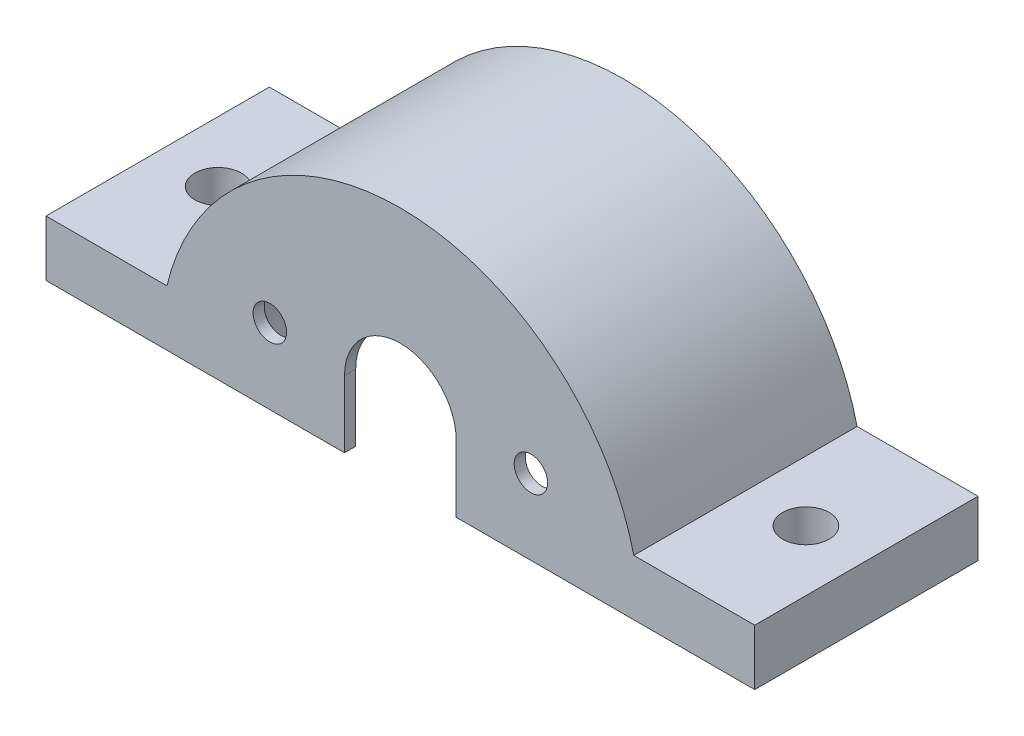
ISO-10303-21;
HEADER;
FILE_DESCRIPTION(('STEP AP214'),'2;1');
FILE_NAME('part.step','',(''),(''),'','','');
FILE_SCHEMA(('AUTOMOTIVE_DESIGN { 1 0 10303 214 1 1 1 1 }'));
ENDSEC;
DATA;
#1=APPLICATION_CONTEXT('core data for automotive mechanical design processes');
#2=APPLICATION_PROTOCOL_DEFINITION('international standard','automotive_design',2000,#1);
#3=PRODUCT_CONTEXT('',#1,'mechanical');
#4=PRODUCT('Part','Part','',(#3));
#5=PRODUCT_RELATED_PRODUCT_CATEGORY('part','',(#4));
#6=PRODUCT_DEFINITION_FORMATION('','',#4);
#7=PRODUCT_DEFINITION_CONTEXT('part definition',#1,'design');
#8=PRODUCT_DEFINITION('design','',#6,#7);
#9=PRODUCT_DEFINITION_SHAPE('','',#8);
#10=(LENGTH_UNIT() NAMED_UNIT(*) SI_UNIT(.MILLI.,.METRE.));
#11=(NAMED_UNIT(*) PLANE_ANGLE_UNIT() SI_UNIT($,.RADIAN.));
#12=(NAMED_UNIT(*) SI_UNIT($,.STERADIAN.) SOLID_ANGLE_UNIT());
#13=UNCERTAINTY_MEASURE_WITH_UNIT(LENGTH_MEASURE(1.E-05),#10,'distance_accuracy_value','');
#14=(GEOMETRIC_REPRESENTATION_CONTEXT(3) GLOBAL_UNCERTAINTY_ASSIGNED_CONTEXT((#13)) GLOBAL_UNIT_ASSIGNED_CONTEXT((#10,
#11,#12)) REPRESENTATION_CONTEXT('',''));
#15=CARTESIAN_POINT('',(0.,0.,0.));
#16=DIRECTION('',(0.,0.,1.));
#17=DIRECTION('',(1.,0.,0.));
#18=AXIS2_PLACEMENT_3D('',#15,#16,#17);
#19=CARTESIAN_POINT('',(0.,0.,20.));
#20=DIRECTION('',(0.,0.,-1.));
#21=DIRECTION('',(-1.,0.,0.));
#22=AXIS2_PLACEMENT_3D('',#19,#20,#21);
#23=CYLINDRICAL_SURFACE('',#22,16.5);
#24=DIRECTION('',(0.,0.,-1.));
#25=VECTOR('',#24,1.);
#26=CARTESIAN_POINT('',(16.5,0.,20.));
#27=LINE('',#26,#25);
#28=CARTESIAN_POINT('',(16.5,0.,19.));
#29=VERTEX_POINT('',#28);
#30=CARTESIAN_POINT('',(16.5,0.,0.));
#31=VERTEX_POINT('',#30);
#32=EDGE_CURVE('E11',#29,#31,#27,.T.);
#33=ORIENTED_EDGE('',*,*,#32,.F.);
#34=CARTESIAN_POINT('',(0.,0.,19.));
#35=DIRECTION('',(0.,0.,1.));
#36=DIRECTION('',(-1.,0.,0.));
#37=AXIS2_PLACEMENT_3D('',#34,#35,#36);
#38=CIRCLE('',#37,16.5);
#39=CARTESIAN_POINT('',(-16.5,0.,19.));
#40=VERTEX_POINT('',#39);
#41=EDGE_CURVE('E177',#29,#40,#38,.T.);
#42=ORIENTED_EDGE('',*,*,#41,.T.);
#43=DIRECTION('',(0.,0.,-1.));
#44=VECTOR('',#43,1.);
#45=CARTESIAN_POINT('',(-16.5,0.,20.));
#46=LINE('',#45,#44);
#47=CARTESIAN_POINT('',(-16.5,0.,0.));
#48=VERTEX_POINT('',#47);
#49=EDGE_CURVE('E86',#40,#48,#46,.T.);
#50=ORIENTED_EDGE('',*,*,#49,.T.);
#51=CARTESIAN_POINT('',(0.,0.,0.));
#52=DIRECTION('',(0.,0.,-1.));
#53=DIRECTION('',(-1.,0.,0.));
#54=AXIS2_PLACEMENT_3D('',#51,#52,#53);
#55=CIRCLE('',#54,16.5);
#56=EDGE_CURVE('E134',#48,#31,#55,.T.);
#57=ORIENTED_EDGE('',*,*,#56,.T.);
#58=EDGE_LOOP('',(#33,#42,#50,#57));
#59=FACE_BOUND('',#58,.T.);
#60=ADVANCED_FACE('F32',(#59),#23,.F.);
#61=CARTESIAN_POINT('',(16.5,0.,20.));
#62=DIRECTION('',(0.,1.,0.));
#63=DIRECTION('',(-1.,0.,0.));
#64=AXIS2_PLACEMENT_3D('',#61,#62,#63);
#65=PLANE('',#64);
#66=CARTESIAN_POINT('',(26.3252618331632,0.,10.));
#67=DIRECTION('',(0.,1.,0.));
#68=DIRECTION('',(-1.,0.,0.));
#69=AXIS2_PLACEMENT_3D('',#66,#67,#68);
#70=CIRCLE('',#69,2.0828);
#71=CARTESIAN_POINT('',(24.2424618331632,0.,10.));
#72=VERTEX_POINT('',#71);
#73=EDGE_CURVE('E171',#72,#72,#70,.T.);
#74=ORIENTED_EDGE('',*,*,#73,.T.);
#75=EDGE_LOOP('',(#74));
#76=FACE_BOUND('',#75,.T.);
#77=DIRECTION('',(1.,0.,0.));
#78=VECTOR('',#77,1.);
#79=CARTESIAN_POINT('',(16.5,0.,0.));
#80=LINE('',#79,#78);
#81=CARTESIAN_POINT('',(31.74,0.,0.));
#82=VERTEX_POINT('',#81);
#83=EDGE_CURVE('E136',#31,#82,#80,.T.);
#84=ORIENTED_EDGE('',*,*,#83,.T.);
#85=DIRECTION('',(0.,0.,-1.));
#86=VECTOR('',#85,1.);
#87=CARTESIAN_POINT('',(31.74,0.,20.));
#88=LINE('',#87,#86);
#89=CARTESIAN_POINT('',(31.74,0.,20.));
#90=VERTEX_POINT('',#89);
#91=EDGE_CURVE('E41',#90,#82,#88,.T.);
#92=ORIENTED_EDGE('',*,*,#91,.F.);
#93=DIRECTION('',(1.,0.,0.));
#94=VECTOR('',#93,1.);
#95=CARTESIAN_POINT('',(16.5,0.,20.));
#96=LINE('',#95,#94);
#97=CARTESIAN_POINT('',(5.,0.,20.));
#98=VERTEX_POINT('',#97);
#99=EDGE_CURVE('E94',#98,#90,#96,.T.);
#100=ORIENTED_EDGE('',*,*,#99,.F.);
#101=DIRECTION('',(0.,0.,1.));
#102=VECTOR('',#101,1.);
#103=CARTESIAN_POINT('',(5.,0.,19.));
#104=LINE('',#103,#102);
#105=CARTESIAN_POINT('',(5.,0.,19.));
#106=VERTEX_POINT('',#105);
#107=EDGE_CURVE('E137',#106,#98,#104,.T.);
#108=ORIENTED_EDGE('',*,*,#107,.F.);
#109=DIRECTION('',(1.,0.,0.));
#110=VECTOR('',#109,1.);
#111=CARTESIAN_POINT('',(5.,0.,19.));
#112=LINE('',#111,#110);
#113=EDGE_CURVE('E192',#106,#29,#112,.T.);
#114=ORIENTED_EDGE('',*,*,#113,.T.);
#115=ORIENTED_EDGE('',*,*,#32,.T.);
#116=EDGE_LOOP('',(#84,#92,#100,#108,#114,#115));
#117=FACE_BOUND('',#116,.T.);
#118=ADVANCED_FACE('F263',(#76,#117),#65,.F.);
#119=CARTESIAN_POINT('',(31.74,0.,20.));
#120=DIRECTION('',(-1.,0.,0.));
#121=DIRECTION('',(0.,0.,1.));
#122=AXIS2_PLACEMENT_3D('',#119,#120,#121);
#123=PLANE('',#122);
#124=DIRECTION('',(0.,1.,0.));
#125=VECTOR('',#124,1.);
#126=CARTESIAN_POINT('',(31.74,0.,0.));
#127=LINE('',#126,#125);
#128=CARTESIAN_POINT('',(31.74,5.,0.));
#129=VERTEX_POINT('',#128);
#130=EDGE_CURVE('E139',#82,#129,#127,.T.);
#131=ORIENTED_EDGE('',*,*,#130,.T.);
#132=DIRECTION('',(0.,0.,-1.));
#133=VECTOR('',#132,1.);
#134=CARTESIAN_POINT('',(31.74,5.,20.));
#135=LINE('',#134,#133);
#136=CARTESIAN_POINT('',(31.74,5.,20.));
#137=VERTEX_POINT('',#136);
#138=EDGE_CURVE('E154',#137,#129,#135,.T.);
#139=ORIENTED_EDGE('',*,*,#138,.F.);
#140=DIRECTION('',(0.,1.,0.));
#141=VECTOR('',#140,1.);
#142=CARTESIAN_POINT('',(31.74,0.,20.));
#143=LINE('',#142,#141);
#144=EDGE_CURVE('E213',#90,#137,#143,.T.);
#145=ORIENTED_EDGE('',*,*,#144,.F.);
#146=ORIENTED_EDGE('',*,*,#91,.T.);
#147=EDGE_LOOP('',(#131,#139,#145,#146));
#148=FACE_BOUND('',#147,.T.);
#149=ADVANCED_FACE('F217',(#148),#123,.F.);
#150=CARTESIAN_POINT('',(31.74,5.,20.));
#151=DIRECTION('',(0.,-1.,0.));
#152=DIRECTION('',(1.,0.,0.));
#153=AXIS2_PLACEMENT_3D('',#150,#151,#152);
#154=PLANE('',#153);
#155=CARTESIAN_POINT('',(26.3252618331632,5.,10.));
#156=DIRECTION('',(0.,1.,0.));
#157=DIRECTION('',(-1.,0.,0.));
#158=AXIS2_PLACEMENT_3D('',#155,#156,#157);
#159=CIRCLE('',#158,2.0828);
#160=CARTESIAN_POINT('',(24.2424618331632,5.,10.));
#161=VERTEX_POINT('',#160);
#162=EDGE_CURVE('E328',#161,#161,#159,.T.);
#163=ORIENTED_EDGE('',*,*,#162,.F.);
#164=EDGE_LOOP('',(#163));
#165=FACE_BOUND('',#164,.T.);
#166=DIRECTION('',(-1.,0.,0.));
#167=VECTOR('',#166,1.);
#168=CARTESIAN_POINT('',(31.74,5.,0.));
#169=LINE('',#168,#167);
#170=CARTESIAN_POINT('',(20.9105236663265,5.,0.));
#171=VERTEX_POINT('',#170);
#172=EDGE_CURVE('E141',#129,#171,#169,.T.);
#173=ORIENTED_EDGE('',*,*,#172,.T.);
#174=DIRECTION('',(0.,0.,-1.));
#175=VECTOR('',#174,1.);
#176=CARTESIAN_POINT('',(20.9105236663265,5.,20.));
#177=LINE('',#176,#175);
#178=CARTESIAN_POINT('',(20.9105236663265,5.,20.));
#179=VERTEX_POINT('',#178);
#180=EDGE_CURVE('E124',#179,#171,#177,.T.);
#181=ORIENTED_EDGE('',*,*,#180,.F.);
#182=DIRECTION('',(-1.,0.,0.));
#183=VECTOR('',#182,1.);
#184=CARTESIAN_POINT('',(31.74,5.,20.));
#185=LINE('',#184,#183);
#186=EDGE_CURVE('E112',#137,#179,#185,.T.);
#187=ORIENTED_EDGE('',*,*,#186,.F.);
#188=ORIENTED_EDGE('',*,*,#138,.T.);
#189=EDGE_LOOP('',(#173,#181,#187,#188));
#190=FACE_BOUND('',#189,.T.);
#191=ADVANCED_FACE('F221',(#165,#190),#154,.F.);
#192=CARTESIAN_POINT('',(0.,0.,20.));
#193=DIRECTION('',(0.,0.,-1.));
#194=DIRECTION('',(-1.,0.,0.));
#195=AXIS2_PLACEMENT_3D('',#192,#193,#194);
#196=CYLINDRICAL_SURFACE('',#195,21.5);
#197=CARTESIAN_POINT('',(0.,0.,0.));
#198=DIRECTION('',(0.,0.,1.));
#199=DIRECTION('',(-1.,0.,0.));
#200=AXIS2_PLACEMENT_3D('',#197,#198,#199);
#201=CIRCLE('',#200,21.5);
#202=CARTESIAN_POINT('',(-20.9105236663265,5.,0.));
#203=VERTEX_POINT('',#202);
#204=EDGE_CURVE('E121',#171,#203,#201,.T.);
#205=ORIENTED_EDGE('',*,*,#204,.T.);
#206=DIRECTION('',(0.,0.,-1.));
#207=VECTOR('',#206,1.);
#208=CARTESIAN_POINT('',(-20.9105236663265,5.,20.));
#209=LINE('',#208,#207);
#210=CARTESIAN_POINT('',(-20.9105236663265,5.,20.));
#211=VERTEX_POINT('',#210);
#212=EDGE_CURVE('E118',#211,#203,#209,.T.);
#213=ORIENTED_EDGE('',*,*,#212,.F.);
#214=CARTESIAN_POINT('',(0.,0.,20.));
#215=DIRECTION('',(0.,0.,1.));
#216=DIRECTION('',(-1.,0.,0.));
#217=AXIS2_PLACEMENT_3D('',#214,#215,#216);
#218=CIRCLE('',#217,21.5);
#219=EDGE_CURVE('E105',#179,#211,#218,.T.);
#220=ORIENTED_EDGE('',*,*,#219,.F.);
#221=ORIENTED_EDGE('',*,*,#180,.T.);
#222=EDGE_LOOP('',(#205,#213,#220,#221));
#223=FACE_BOUND('',#222,.T.);
#224=ADVANCED_FACE('F119',(#223),#196,.T.);
#225=CARTESIAN_POINT('',(-31.74,5.,20.));
#226=DIRECTION('',(0.,-1.,0.));
#227=DIRECTION('',(1.,0.,0.));
#228=AXIS2_PLACEMENT_3D('',#225,#226,#227);
#229=PLANE('',#228);
#230=CARTESIAN_POINT('',(-26.3252618331632,5.,10.));
#231=DIRECTION('',(0.,1.,0.));
#232=DIRECTION('',(1.,0.,0.));
#233=AXIS2_PLACEMENT_3D('',#230,#231,#232);
#234=CIRCLE('',#233,2.0828);
#235=CARTESIAN_POINT('',(-24.2424618331632,5.,10.));
#236=VERTEX_POINT('',#235);
#237=EDGE_CURVE('E174',#236,#236,#234,.T.);
#238=ORIENTED_EDGE('',*,*,#237,.F.);
#239=EDGE_LOOP('',(#238));
#240=FACE_BOUND('',#239,.T.);
#241=DIRECTION('',(-1.,0.,0.));
#242=VECTOR('',#241,1.);
#243=CARTESIAN_POINT('',(-31.74,5.,0.));
#244=LINE('',#243,#242);
#245=CARTESIAN_POINT('',(-31.74,5.,0.));
#246=VERTEX_POINT('',#245);
#247=EDGE_CURVE('E144',#203,#246,#244,.T.);
#248=ORIENTED_EDGE('',*,*,#247,.T.);
#249=DIRECTION('',(0.,0.,-1.));
#250=VECTOR('',#249,1.);
#251=CARTESIAN_POINT('',(-31.74,5.,20.));
#252=LINE('',#251,#250);
#253=CARTESIAN_POINT('',(-31.74,5.,20.));
#254=VERTEX_POINT('',#253);
#255=EDGE_CURVE('E125',#254,#246,#252,.T.);
#256=ORIENTED_EDGE('',*,*,#255,.F.);
#257=DIRECTION('',(-1.,0.,0.));
#258=VECTOR('',#257,1.);
#259=CARTESIAN_POINT('',(-31.74,5.,20.));
#260=LINE('',#259,#258);
#261=EDGE_CURVE('E109',#211,#254,#260,.T.);
#262=ORIENTED_EDGE('',*,*,#261,.F.);
#263=ORIENTED_EDGE('',*,*,#212,.T.);
#264=EDGE_LOOP('',(#248,#256,#262,#263));
#265=FACE_BOUND('',#264,.T.);
#266=ADVANCED_FACE('F127',(#240,#265),#229,.F.);
#267=CARTESIAN_POINT('',(-31.74,0.,20.));
#268=DIRECTION('',(1.,0.,0.));
#269=DIRECTION('',(0.,0.,-1.));
#270=AXIS2_PLACEMENT_3D('',#267,#268,#269);
#271=PLANE('',#270);
#272=DIRECTION('',(0.,-1.,0.));
#273=VECTOR('',#272,1.);
#274=CARTESIAN_POINT('',(-31.74,0.,0.));
#275=LINE('',#274,#273);
#276=CARTESIAN_POINT('',(-31.74,0.,0.));
#277=VERTEX_POINT('',#276);
#278=EDGE_CURVE('E78',#246,#277,#275,.T.);
#279=ORIENTED_EDGE('',*,*,#278,.T.);
#280=DIRECTION('',(0.,0.,-1.));
#281=VECTOR('',#280,1.);
#282=CARTESIAN_POINT('',(-31.74,0.,20.));
#283=LINE('',#282,#281);
#284=CARTESIAN_POINT('',(-31.74,0.,20.));
#285=VERTEX_POINT('',#284);
#286=EDGE_CURVE('E150',#285,#277,#283,.T.);
#287=ORIENTED_EDGE('',*,*,#286,.F.);
#288=DIRECTION('',(0.,-1.,0.));
#289=VECTOR('',#288,1.);
#290=CARTESIAN_POINT('',(-31.74,0.,20.));
#291=LINE('',#290,#289);
#292=EDGE_CURVE('E50',#254,#285,#291,.T.);
#293=ORIENTED_EDGE('',*,*,#292,.F.);
#294=ORIENTED_EDGE('',*,*,#255,.T.);
#295=EDGE_LOOP('',(#279,#287,#293,#294));
#296=FACE_BOUND('',#295,.T.);
#297=ADVANCED_FACE('F226',(#296),#271,.F.);
#298=CARTESIAN_POINT('',(-16.5,0.,20.));
#299=DIRECTION('',(0.,1.,0.));
#300=DIRECTION('',(-1.,0.,0.));
#301=AXIS2_PLACEMENT_3D('',#298,#299,#300);
#302=PLANE('',#301);
#303=CARTESIAN_POINT('',(-26.3252618331632,0.,10.));
#304=DIRECTION('',(0.,1.,0.));
#305=DIRECTION('',(1.,0.,0.));
#306=AXIS2_PLACEMENT_3D('',#303,#304,#305);
#307=CIRCLE('',#306,2.0828);
#308=CARTESIAN_POINT('',(-24.2424618331632,0.,10.));
#309=VERTEX_POINT('',#308);
#310=EDGE_CURVE('E329',#309,#309,#307,.T.);
#311=ORIENTED_EDGE('',*,*,#310,.T.);
#312=EDGE_LOOP('',(#311));
#313=FACE_BOUND('',#312,.T.);
#314=DIRECTION('',(1.,0.,0.));
#315=VECTOR('',#314,1.);
#316=CARTESIAN_POINT('',(-16.5,0.,0.));
#317=LINE('',#316,#315);
#318=EDGE_CURVE('E147',#277,#48,#317,.T.);
#319=ORIENTED_EDGE('',*,*,#318,.T.);
#320=ORIENTED_EDGE('',*,*,#49,.F.);
#321=DIRECTION('',(1.,0.,0.));
#322=VECTOR('',#321,1.);
#323=CARTESIAN_POINT('',(-5.,0.,19.));
#324=LINE('',#323,#322);
#325=CARTESIAN_POINT('',(-5.,0.,19.));
#326=VERTEX_POINT('',#325);
#327=EDGE_CURVE('E179',#40,#326,#324,.T.);
#328=ORIENTED_EDGE('',*,*,#327,.T.);
#329=DIRECTION('',(0.,0.,1.));
#330=VECTOR('',#329,1.);
#331=CARTESIAN_POINT('',(-5.,0.,19.));
#332=LINE('',#331,#330);
#333=CARTESIAN_POINT('',(-5.,0.,20.));
#334=VERTEX_POINT('',#333);
#335=EDGE_CURVE('E195',#326,#334,#332,.T.);
#336=ORIENTED_EDGE('',*,*,#335,.T.);
#337=DIRECTION('',(1.,0.,0.));
#338=VECTOR('',#337,1.);
#339=CARTESIAN_POINT('',(-16.5,0.,20.));
#340=LINE('',#339,#338);
#341=EDGE_CURVE('E129',#285,#334,#340,.T.);
#342=ORIENTED_EDGE('',*,*,#341,.F.);
#343=ORIENTED_EDGE('',*,*,#286,.T.);
#344=EDGE_LOOP('',(#319,#320,#328,#336,#342,#343));
#345=FACE_BOUND('',#344,.T.);
#346=ADVANCED_FACE('F229',(#313,#345),#302,.F.);
#347=CARTESIAN_POINT('',(0.,0.,20.));
#348=DIRECTION('',(0.,0.,-1.));
#349=DIRECTION('',(-1.,0.,0.));
#350=AXIS2_PLACEMENT_3D('',#347,#348,#349);
#351=PLANE('',#350);
#352=CARTESIAN_POINT('',(11.69134295109,6.7499999999999,20.));
#353=DIRECTION('',(0.,0.,1.));
#354=DIRECTION('',(1.,0.,0.));
#355=AXIS2_PLACEMENT_3D('',#352,#353,#354);
#356=CIRCLE('',#355,1.5);
#357=CARTESIAN_POINT('',(13.19134295109,6.7499999999999,20.));
#358=VERTEX_POINT('',#357);
#359=EDGE_CURVE('E160',#358,#358,#356,.T.);
#360=ORIENTED_EDGE('',*,*,#359,.F.);
#361=EDGE_LOOP('',(#360));
#362=FACE_BOUND('',#361,.T.);
#363=CARTESIAN_POINT('',(-11.6913429510899,6.75000000000007,20.));
#364=DIRECTION('',(0.,0.,1.));
#365=DIRECTION('',(1.,0.,0.));
#366=AXIS2_PLACEMENT_3D('',#363,#364,#365);
#367=CIRCLE('',#366,1.5);
#368=CARTESIAN_POINT('',(-10.1913429510899,6.75000000000007,20.));
#369=VERTEX_POINT('',#368);
#370=EDGE_CURVE('E166',#369,#369,#367,.T.);
#371=ORIENTED_EDGE('',*,*,#370,.F.);
#372=EDGE_LOOP('',(#371));
#373=FACE_BOUND('',#372,.T.);
#374=ORIENTED_EDGE('',*,*,#341,.T.);
#375=DIRECTION('',(0.,1.,0.));
#376=VECTOR('',#375,1.);
#377=CARTESIAN_POINT('',(-5.,0.,20.));
#378=LINE('',#377,#376);
#379=CARTESIAN_POINT('',(-5.,6.,20.));
#380=VERTEX_POINT('',#379);
#381=EDGE_CURVE('E164',#334,#380,#378,.T.);
#382=ORIENTED_EDGE('',*,*,#381,.T.);
#383=CARTESIAN_POINT('',(0.,6.,20.));
#384=DIRECTION('',(0.,0.,-1.));
#385=DIRECTION('',(1.,0.,0.));
#386=AXIS2_PLACEMENT_3D('',#383,#384,#385);
#387=CIRCLE('',#386,5.);
#388=CARTESIAN_POINT('',(5.,6.,20.));
#389=VERTEX_POINT('',#388);
#390=EDGE_CURVE('E198',#380,#389,#387,.T.);
#391=ORIENTED_EDGE('',*,*,#390,.T.);
#392=DIRECTION('',(0.,-1.,0.));
#393=VECTOR('',#392,1.);
#394=CARTESIAN_POINT('',(5.,0.,20.));
#395=LINE('',#394,#393);
#396=EDGE_CURVE('E180',#389,#98,#395,.T.);
#397=ORIENTED_EDGE('',*,*,#396,.T.);
#398=ORIENTED_EDGE('',*,*,#99,.T.);
#399=ORIENTED_EDGE('',*,*,#144,.T.);
#400=ORIENTED_EDGE('',*,*,#186,.T.);
#401=ORIENTED_EDGE('',*,*,#219,.T.);
#402=ORIENTED_EDGE('',*,*,#261,.T.);
#403=ORIENTED_EDGE('',*,*,#292,.T.);
#404=EDGE_LOOP('',(#374,#382,#391,#397,#398,#399,#400,#401,#402,#403));
#405=FACE_BOUND('',#404,.T.);
#406=ADVANCED_FACE('F107',(#362,#373,#405),#351,.F.);
#407=CARTESIAN_POINT('',(0.,0.,0.));
#408=DIRECTION('',(0.,0.,-1.));
#409=DIRECTION('',(-1.,0.,0.));
#410=AXIS2_PLACEMENT_3D('',#407,#408,#409);
#411=PLANE('',#410);
#412=ORIENTED_EDGE('',*,*,#56,.F.);
#413=ORIENTED_EDGE('',*,*,#318,.F.);
#414=ORIENTED_EDGE('',*,*,#278,.F.);
#415=ORIENTED_EDGE('',*,*,#247,.F.);
#416=ORIENTED_EDGE('',*,*,#204,.F.);
#417=ORIENTED_EDGE('',*,*,#172,.F.);
#418=ORIENTED_EDGE('',*,*,#130,.F.);
#419=ORIENTED_EDGE('',*,*,#83,.F.);
#420=EDGE_LOOP('',(#412,#413,#414,#415,#416,#417,#418,#419));
#421=FACE_BOUND('',#420,.T.);
#422=ADVANCED_FACE('F224',(#421),#411,.T.);
#423=CARTESIAN_POINT('',(5.,0.,19.));
#424=DIRECTION('',(-1.,0.,0.));
#425=DIRECTION('',(0.,-1.,0.));
#426=AXIS2_PLACEMENT_3D('',#423,#424,#425);
#427=PLANE('',#426);
#428=ORIENTED_EDGE('',*,*,#396,.F.);
#429=DIRECTION('',(0.,0.,1.));
#430=VECTOR('',#429,1.);
#431=CARTESIAN_POINT('',(5.,6.,19.));
#432=LINE('',#431,#430);
#433=CARTESIAN_POINT('',(5.,6.,19.));
#434=VERTEX_POINT('',#433);
#435=EDGE_CURVE('E204',#434,#389,#432,.T.);
#436=ORIENTED_EDGE('',*,*,#435,.F.);
#437=DIRECTION('',(0.,-1.,0.));
#438=VECTOR('',#437,1.);
#439=CARTESIAN_POINT('',(5.,0.,19.));
#440=LINE('',#439,#438);
#441=EDGE_CURVE('E189',#434,#106,#440,.T.);
#442=ORIENTED_EDGE('',*,*,#441,.T.);
#443=ORIENTED_EDGE('',*,*,#107,.T.);
#444=EDGE_LOOP('',(#428,#436,#442,#443));
#445=FACE_BOUND('',#444,.T.);
#446=ADVANCED_FACE('F291',(#445),#427,.T.);
#447=CARTESIAN_POINT('',(0.,6.,19.));
#448=DIRECTION('',(0.,0.,1.));
#449=DIRECTION('',(1.,0.,0.));
#450=AXIS2_PLACEMENT_3D('',#447,#448,#449);
#451=CYLINDRICAL_SURFACE('',#450,5.);
#452=ORIENTED_EDGE('',*,*,#390,.F.);
#453=DIRECTION('',(0.,0.,1.));
#454=VECTOR('',#453,1.);
#455=CARTESIAN_POINT('',(-5.,6.,19.));
#456=LINE('',#455,#454);
#457=CARTESIAN_POINT('',(-5.,6.,19.));
#458=VERTEX_POINT('',#457);
#459=EDGE_CURVE('E207',#458,#380,#456,.T.);
#460=ORIENTED_EDGE('',*,*,#459,.F.);
#461=CARTESIAN_POINT('',(0.,6.,19.));
#462=DIRECTION('',(0.,0.,-1.));
#463=DIRECTION('',(1.,0.,0.));
#464=AXIS2_PLACEMENT_3D('',#461,#462,#463);
#465=CIRCLE('',#464,5.);
#466=EDGE_CURVE('E186',#458,#434,#465,.T.);
#467=ORIENTED_EDGE('',*,*,#466,.T.);
#468=ORIENTED_EDGE('',*,*,#435,.T.);
#469=EDGE_LOOP('',(#452,#460,#467,#468));
#470=FACE_BOUND('',#469,.T.);
#471=ADVANCED_FACE('F298',(#470),#451,.F.);
#472=CARTESIAN_POINT('',(-5.,0.,19.));
#473=DIRECTION('',(1.,0.,0.));
#474=DIRECTION('',(0.,1.,0.));
#475=AXIS2_PLACEMENT_3D('',#472,#473,#474);
#476=PLANE('',#475);
#477=ORIENTED_EDGE('',*,*,#381,.F.);
#478=ORIENTED_EDGE('',*,*,#335,.F.);
#479=DIRECTION('',(0.,1.,0.));
#480=VECTOR('',#479,1.);
#481=CARTESIAN_POINT('',(-5.,0.,19.));
#482=LINE('',#481,#480);
#483=EDGE_CURVE('E183',#326,#458,#482,.T.);
#484=ORIENTED_EDGE('',*,*,#483,.T.);
#485=ORIENTED_EDGE('',*,*,#459,.T.);
#486=EDGE_LOOP('',(#477,#478,#484,#485));
#487=FACE_BOUND('',#486,.T.);
#488=ADVANCED_FACE('F295',(#487),#476,.T.);
#489=CARTESIAN_POINT('',(0.,0.,19.));
#490=DIRECTION('',(0.,0.,-1.));
#491=DIRECTION('',(-1.,0.,0.));
#492=AXIS2_PLACEMENT_3D('',#489,#490,#491);
#493=PLANE('',#492);
#494=CARTESIAN_POINT('',(11.69134295109,6.7499999999999,19.));
#495=DIRECTION('',(0.,0.,-1.));
#496=DIRECTION('',(-1.,0.,0.));
#497=AXIS2_PLACEMENT_3D('',#494,#495,#496);
#498=CIRCLE('',#497,1.5);
#499=CARTESIAN_POINT('',(10.19134295109,6.7499999999999,19.));
#500=VERTEX_POINT('',#499);
#501=EDGE_CURVE('E35',#500,#500,#498,.T.);
#502=ORIENTED_EDGE('',*,*,#501,.F.);
#503=EDGE_LOOP('',(#502));
#504=FACE_BOUND('',#503,.T.);
#505=CARTESIAN_POINT('',(-11.6913429510899,6.75000000000007,19.));
#506=DIRECTION('',(0.,0.,-1.));
#507=DIRECTION('',(-1.,0.,0.));
#508=AXIS2_PLACEMENT_3D('',#505,#506,#507);
#509=CIRCLE('',#508,1.5);
#510=CARTESIAN_POINT('',(-13.1913429510899,6.75000000000007,19.));
#511=VERTEX_POINT('',#510);
#512=EDGE_CURVE('E158',#511,#511,#509,.T.);
#513=ORIENTED_EDGE('',*,*,#512,.F.);
#514=EDGE_LOOP('',(#513));
#515=FACE_BOUND('',#514,.T.);
#516=ORIENTED_EDGE('',*,*,#41,.F.);
#517=ORIENTED_EDGE('',*,*,#113,.F.);
#518=ORIENTED_EDGE('',*,*,#441,.F.);
#519=ORIENTED_EDGE('',*,*,#466,.F.);
#520=ORIENTED_EDGE('',*,*,#483,.F.);
#521=ORIENTED_EDGE('',*,*,#327,.F.);
#522=EDGE_LOOP('',(#516,#517,#518,#519,#520,#521));
#523=FACE_BOUND('',#522,.T.);
#524=ADVANCED_FACE('F260',(#504,#515,#523),#493,.T.);
#525=CARTESIAN_POINT('',(-11.6913429510899,6.75000000000007,0.));
#526=DIRECTION('',(0.,0.,1.));
#527=DIRECTION('',(1.,0.,0.));
#528=AXIS2_PLACEMENT_3D('',#525,#526,#527);
#529=CYLINDRICAL_SURFACE('',#528,1.5);
#530=ORIENTED_EDGE('',*,*,#512,.T.);
#531=EDGE_LOOP('',(#530));
#532=FACE_BOUND('',#531,.T.);
#533=ORIENTED_EDGE('',*,*,#370,.T.);
#534=EDGE_LOOP('',(#533));
#535=FACE_BOUND('',#534,.T.);
#536=ADVANCED_FACE('F307',(#532,#535),#529,.F.);
#537=CARTESIAN_POINT('',(11.69134295109,6.7499999999999,0.));
#538=DIRECTION('',(0.,0.,1.));
#539=DIRECTION('',(1.,0.,0.));
#540=AXIS2_PLACEMENT_3D('',#537,#538,#539);
#541=CYLINDRICAL_SURFACE('',#540,1.5);
#542=ORIENTED_EDGE('',*,*,#501,.T.);
#543=EDGE_LOOP('',(#542));
#544=FACE_BOUND('',#543,.T.);
#545=ORIENTED_EDGE('',*,*,#359,.T.);
#546=EDGE_LOOP('',(#545));
#547=FACE_BOUND('',#546,.T.);
#548=ADVANCED_FACE('F311',(#544,#547),#541,.F.);
#549=CARTESIAN_POINT('',(-26.3252618331632,0.,10.));
#550=DIRECTION('',(0.,1.,0.));
#551=DIRECTION('',(-1.,0.,0.));
#552=AXIS2_PLACEMENT_3D('',#549,#550,#551);
#553=CYLINDRICAL_SURFACE('',#552,2.0828);
#554=ORIENTED_EDGE('',*,*,#310,.F.);
#555=EDGE_LOOP('',(#554));
#556=FACE_BOUND('',#555,.T.);
#557=ORIENTED_EDGE('',*,*,#237,.T.);
#558=EDGE_LOOP('',(#557));
#559=FACE_BOUND('',#558,.T.);
#560=ADVANCED_FACE('F314',(#556,#559),#553,.F.);
#561=CARTESIAN_POINT('',(26.3252618331632,0.,10.));
#562=DIRECTION('',(0.,1.,0.));
#563=DIRECTION('',(-1.,0.,0.));
#564=AXIS2_PLACEMENT_3D('',#561,#562,#563);
#565=CYLINDRICAL_SURFACE('',#564,2.0828);
#566=ORIENTED_EDGE('',*,*,#73,.F.);
#567=EDGE_LOOP('',(#566));
#568=FACE_BOUND('',#567,.T.);
#569=ORIENTED_EDGE('',*,*,#162,.T.);
#570=EDGE_LOOP('',(#569));
#571=FACE_BOUND('',#570,.T.);
#572=ADVANCED_FACE('F318',(#568,#571),#565,.F.);
#573=CLOSED_SHELL('',(#60,#118,#149,#191,#224,#266,#297,#346,#406,#422,#446,#471,#488,#524,#536,
#548,#560,#572));
#574=MANIFOLD_SOLID_BREP('B2',#573);
#575=ADVANCED_BREP_SHAPE_REPRESENTATION('',(#18,#574),#14);
#576=SHAPE_DEFINITION_REPRESENTATION(#9,#575);
ENDSEC;
END-ISO-10303-21;
